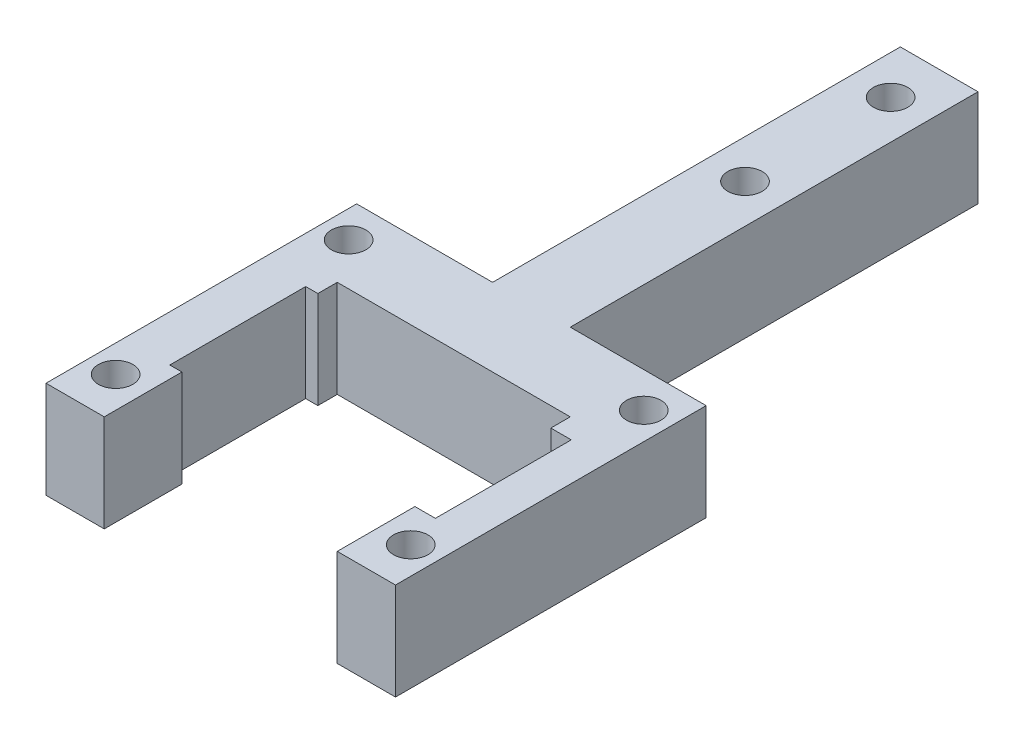
ISO-10303-21;
HEADER;
FILE_DESCRIPTION(('STEP AP214'),'2;1');
FILE_NAME('part.step','',(''),(''),'','','');
FILE_SCHEMA(('AUTOMOTIVE_DESIGN { 1 0 10303 214 1 1 1 1 }'));
ENDSEC;
DATA;
#1=APPLICATION_CONTEXT('core data for automotive mechanical design processes');
#2=APPLICATION_PROTOCOL_DEFINITION('international standard','automotive_design',2000,#1);
#3=PRODUCT_CONTEXT('',#1,'mechanical');
#4=PRODUCT('Part','Part','',(#3));
#5=PRODUCT_RELATED_PRODUCT_CATEGORY('part','',(#4));
#6=PRODUCT_DEFINITION_FORMATION('','',#4);
#7=PRODUCT_DEFINITION_CONTEXT('part definition',#1,'design');
#8=PRODUCT_DEFINITION('design','',#6,#7);
#9=PRODUCT_DEFINITION_SHAPE('','',#8);
#10=(LENGTH_UNIT() NAMED_UNIT(*) SI_UNIT(.MILLI.,.METRE.));
#11=(NAMED_UNIT(*) PLANE_ANGLE_UNIT() SI_UNIT($,.RADIAN.));
#12=(NAMED_UNIT(*) SI_UNIT($,.STERADIAN.) SOLID_ANGLE_UNIT());
#13=UNCERTAINTY_MEASURE_WITH_UNIT(LENGTH_MEASURE(1.E-05),#10,'distance_accuracy_value','');
#14=(GEOMETRIC_REPRESENTATION_CONTEXT(3) GLOBAL_UNCERTAINTY_ASSIGNED_CONTEXT((#13)) GLOBAL_UNIT_ASSIGNED_CONTEXT((#10,
#11,#12)) REPRESENTATION_CONTEXT('',''));
#15=CARTESIAN_POINT('',(0.,0.,0.));
#16=DIRECTION('',(0.,0.,1.));
#17=DIRECTION('',(1.,0.,0.));
#18=AXIS2_PLACEMENT_3D('',#15,#16,#17);
#19=CARTESIAN_POINT('',(12.,10.,9.22632055975592));
#20=DIRECTION('',(1.,0.,0.));
#21=DIRECTION('',(0.,0.,-1.));
#22=AXIS2_PLACEMENT_3D('',#19,#20,#21);
#23=PLANE('',#22);
#24=DIRECTION('',(0.,0.,1.));
#25=VECTOR('',#24,1.);
#26=CARTESIAN_POINT('',(12.,0.,9.22632055975592));
#27=LINE('',#26,#25);
#28=CARTESIAN_POINT('',(12.,0.,-14.7736794402441));
#29=VERTEX_POINT('',#28);
#30=CARTESIAN_POINT('',(12.,0.,-12.7736794402441));
#31=VERTEX_POINT('',#30);
#32=EDGE_CURVE('E194',#29,#31,#27,.T.);
#33=ORIENTED_EDGE('',*,*,#32,.T.);
#34=DIRECTION('',(0.,1.,0.));
#35=VECTOR('',#34,1.);
#36=CARTESIAN_POINT('',(12.,0.,-12.7736794402441));
#37=LINE('',#36,#35);
#38=CARTESIAN_POINT('',(12.,10.,-12.7736794402441));
#39=VERTEX_POINT('',#38);
#40=EDGE_CURVE('E284',#31,#39,#37,.T.);
#41=ORIENTED_EDGE('',*,*,#40,.T.);
#42=DIRECTION('',(0.,0.,1.));
#43=VECTOR('',#42,1.);
#44=CARTESIAN_POINT('',(12.,10.,9.22632055975592));
#45=LINE('',#44,#43);
#46=CARTESIAN_POINT('',(12.,10.,-14.7736794402441));
#47=VERTEX_POINT('',#46);
#48=EDGE_CURVE('E286',#47,#39,#45,.T.);
#49=ORIENTED_EDGE('',*,*,#48,.F.);
#50=DIRECTION('',(0.,-1.,0.));
#51=VECTOR('',#50,1.);
#52=CARTESIAN_POINT('',(12.,10.,-14.7736794402441));
#53=LINE('',#52,#51);
#54=EDGE_CURVE('E230',#47,#29,#53,.T.);
#55=ORIENTED_EDGE('',*,*,#54,.T.);
#56=EDGE_LOOP('',(#33,#41,#49,#55));
#57=FACE_BOUND('',#56,.T.);
#58=ADVANCED_FACE('F32',(#57),#23,.F.);
#59=CARTESIAN_POINT('',(-12.,10.,-14.7736794402441));
#60=DIRECTION('',(-1.,0.,0.));
#61=DIRECTION('',(0.,0.,1.));
#62=AXIS2_PLACEMENT_3D('',#59,#60,#61);
#63=PLANE('',#62);
#64=DIRECTION('',(0.,0.,-1.));
#65=VECTOR('',#64,1.);
#66=CARTESIAN_POINT('',(-12.,0.,-14.7736794402441));
#67=LINE('',#66,#65);
#68=CARTESIAN_POINT('',(-12.,0.,9.22632055975593));
#69=VERTEX_POINT('',#68);
#70=CARTESIAN_POINT('',(-12.,0.,1.22632055975593));
#71=VERTEX_POINT('',#70);
#72=EDGE_CURVE('E198',#69,#71,#67,.T.);
#73=ORIENTED_EDGE('',*,*,#72,.T.);
#74=DIRECTION('',(0.,1.,0.));
#75=VECTOR('',#74,1.);
#76=CARTESIAN_POINT('',(-12.,0.,1.22632055975593));
#77=LINE('',#76,#75);
#78=CARTESIAN_POINT('',(-12.,10.,1.22632055975593));
#79=VERTEX_POINT('',#78);
#80=EDGE_CURVE('E347',#71,#79,#77,.T.);
#81=ORIENTED_EDGE('',*,*,#80,.T.);
#82=DIRECTION('',(0.,0.,-1.));
#83=VECTOR('',#82,1.);
#84=CARTESIAN_POINT('',(-12.,10.,-14.7736794402441));
#85=LINE('',#84,#83);
#86=CARTESIAN_POINT('',(-12.,10.,9.22632055975593));
#87=VERTEX_POINT('',#86);
#88=EDGE_CURVE('E324',#87,#79,#85,.T.);
#89=ORIENTED_EDGE('',*,*,#88,.F.);
#90=DIRECTION('',(0.,-1.,0.));
#91=VECTOR('',#90,1.);
#92=CARTESIAN_POINT('',(-12.,10.,9.22632055975593));
#93=LINE('',#92,#91);
#94=EDGE_CURVE('E236',#87,#69,#93,.T.);
#95=ORIENTED_EDGE('',*,*,#94,.T.);
#96=EDGE_LOOP('',(#73,#81,#89,#95));
#97=FACE_BOUND('',#96,.T.);
#98=ADVANCED_FACE('F405',(#97),#63,.F.);
#99=CARTESIAN_POINT('',(-4.,10.,-22.7736794402441));
#100=DIRECTION('',(1.,0.,0.));
#101=DIRECTION('',(0.,0.,-1.));
#102=AXIS2_PLACEMENT_3D('',#99,#100,#101);
#103=PLANE('',#102);
#104=DIRECTION('',(0.,0.,1.));
#105=VECTOR('',#104,1.);
#106=CARTESIAN_POINT('',(-4.,0.,-22.7736794402441));
#107=LINE('',#106,#105);
#108=CARTESIAN_POINT('',(-4.00000000000002,0.,-64.7736794402441));
#109=VERTEX_POINT('',#108);
#110=CARTESIAN_POINT('',(-4.,0.,-22.7736794402441));
#111=VERTEX_POINT('',#110);
#112=EDGE_CURVE('E259',#109,#111,#107,.T.);
#113=ORIENTED_EDGE('',*,*,#112,.T.);
#114=DIRECTION('',(0.,-1.,0.));
#115=VECTOR('',#114,1.);
#116=CARTESIAN_POINT('',(-4.,10.,-22.7736794402441));
#117=LINE('',#116,#115);
#118=CARTESIAN_POINT('',(-4.,10.,-22.7736794402441));
#119=VERTEX_POINT('',#118);
#120=EDGE_CURVE('E11',#119,#111,#117,.T.);
#121=ORIENTED_EDGE('',*,*,#120,.F.);
#122=DIRECTION('',(0.,0.,1.));
#123=VECTOR('',#122,1.);
#124=CARTESIAN_POINT('',(-4.,10.,-22.7736794402441));
#125=LINE('',#124,#123);
#126=CARTESIAN_POINT('',(-4.00000000000002,10.,-64.7736794402441));
#127=VERTEX_POINT('',#126);
#128=EDGE_CURVE('E211',#127,#119,#125,.T.);
#129=ORIENTED_EDGE('',*,*,#128,.F.);
#130=DIRECTION('',(0.,-1.,0.));
#131=VECTOR('',#130,1.);
#132=CARTESIAN_POINT('',(-4.00000000000002,10.,-64.7736794402441));
#133=LINE('',#132,#131);
#134=EDGE_CURVE('E212',#127,#109,#133,.T.);
#135=ORIENTED_EDGE('',*,*,#134,.T.);
#136=EDGE_LOOP('',(#113,#121,#129,#135));
#137=FACE_BOUND('',#136,.T.);
#138=ADVANCED_FACE('F34',(#137),#103,.F.);
#139=CARTESIAN_POINT('',(-18.,10.,-22.7736794402441));
#140=DIRECTION('',(0.,0.,1.));
#141=DIRECTION('',(1.,0.,0.));
#142=AXIS2_PLACEMENT_3D('',#139,#140,#141);
#143=PLANE('',#142);
#144=DIRECTION('',(-1.,0.,0.));
#145=VECTOR('',#144,1.);
#146=CARTESIAN_POINT('',(-18.,0.,-22.7736794402441));
#147=LINE('',#146,#145);
#148=CARTESIAN_POINT('',(-18.,0.,-22.7736794402441));
#149=VERTEX_POINT('',#148);
#150=EDGE_CURVE('E253',#111,#149,#147,.T.);
#151=ORIENTED_EDGE('',*,*,#150,.T.);
#152=DIRECTION('',(0.,-1.,0.));
#153=VECTOR('',#152,1.);
#154=CARTESIAN_POINT('',(-18.,10.,-22.7736794402441));
#155=LINE('',#154,#153);
#156=CARTESIAN_POINT('',(-18.,10.,-22.7736794402441));
#157=VERTEX_POINT('',#156);
#158=EDGE_CURVE('E40',#157,#149,#155,.T.);
#159=ORIENTED_EDGE('',*,*,#158,.F.);
#160=DIRECTION('',(-1.,0.,0.));
#161=VECTOR('',#160,1.);
#162=CARTESIAN_POINT('',(-18.,10.,-22.7736794402441));
#163=LINE('',#162,#161);
#164=EDGE_CURVE('E319',#119,#157,#163,.T.);
#165=ORIENTED_EDGE('',*,*,#164,.F.);
#166=ORIENTED_EDGE('',*,*,#120,.T.);
#167=EDGE_LOOP('',(#151,#159,#165,#166));
#168=FACE_BOUND('',#167,.T.);
#169=ADVANCED_FACE('F430',(#168),#143,.F.);
#170=CARTESIAN_POINT('',(-18.,10.,9.22632055975593));
#171=DIRECTION('',(1.,0.,0.));
#172=DIRECTION('',(0.,0.,-1.));
#173=AXIS2_PLACEMENT_3D('',#170,#171,#172);
#174=PLANE('',#173);
#175=DIRECTION('',(0.,0.,1.));
#176=VECTOR('',#175,1.);
#177=CARTESIAN_POINT('',(-18.,0.,9.22632055975593));
#178=LINE('',#177,#176);
#179=CARTESIAN_POINT('',(-18.,0.,9.22632055975593));
#180=VERTEX_POINT('',#179);
#181=EDGE_CURVE('E248',#149,#180,#178,.T.);
#182=ORIENTED_EDGE('',*,*,#181,.T.);
#183=DIRECTION('',(0.,-1.,0.));
#184=VECTOR('',#183,1.);
#185=CARTESIAN_POINT('',(-18.,10.,9.22632055975593));
#186=LINE('',#185,#184);
#187=CARTESIAN_POINT('',(-18.,10.,9.22632055975593));
#188=VERTEX_POINT('',#187);
#189=EDGE_CURVE('E239',#188,#180,#186,.T.);
#190=ORIENTED_EDGE('',*,*,#189,.F.);
#191=DIRECTION('',(0.,0.,1.));
#192=VECTOR('',#191,1.);
#193=CARTESIAN_POINT('',(-18.,10.,9.22632055975593));
#194=LINE('',#193,#192);
#195=EDGE_CURVE('E249',#157,#188,#194,.T.);
#196=ORIENTED_EDGE('',*,*,#195,.F.);
#197=ORIENTED_EDGE('',*,*,#158,.T.);
#198=EDGE_LOOP('',(#182,#190,#196,#197));
#199=FACE_BOUND('',#198,.T.);
#200=ADVANCED_FACE('F246',(#199),#174,.F.);
#201=CARTESIAN_POINT('',(-12.,10.,9.22632055975593));
#202=DIRECTION('',(0.,0.,-1.));
#203=DIRECTION('',(-1.,0.,0.));
#204=AXIS2_PLACEMENT_3D('',#201,#202,#203);
#205=PLANE('',#204);
#206=DIRECTION('',(1.,0.,0.));
#207=VECTOR('',#206,1.);
#208=CARTESIAN_POINT('',(-12.,0.,9.22632055975593));
#209=LINE('',#208,#207);
#210=EDGE_CURVE('E255',#180,#69,#209,.T.);
#211=ORIENTED_EDGE('',*,*,#210,.T.);
#212=ORIENTED_EDGE('',*,*,#94,.F.);
#213=DIRECTION('',(1.,0.,0.));
#214=VECTOR('',#213,1.);
#215=CARTESIAN_POINT('',(-12.,10.,9.22632055975593));
#216=LINE('',#215,#214);
#217=EDGE_CURVE('E322',#188,#87,#216,.T.);
#218=ORIENTED_EDGE('',*,*,#217,.F.);
#219=ORIENTED_EDGE('',*,*,#189,.T.);
#220=EDGE_LOOP('',(#211,#212,#218,#219));
#221=FACE_BOUND('',#220,.T.);
#222=ADVANCED_FACE('F424',(#221),#205,.F.);
#223=CARTESIAN_POINT('',(-12.,10.,-12.7736794402441));
#224=VERTEX_POINT('',#223);
#225=CARTESIAN_POINT('',(-12.,10.,-14.7736794402441));
#226=VERTEX_POINT('',#225);
#227=EDGE_CURVE('E323',#224,#226,#85,.T.);
#228=ORIENTED_EDGE('',*,*,#227,.F.);
#229=DIRECTION('',(0.,1.,0.));
#230=VECTOR('',#229,1.);
#231=CARTESIAN_POINT('',(-12.,0.,-12.7736794402441));
#232=LINE('',#231,#230);
#233=CARTESIAN_POINT('',(-12.,0.,-12.7736794402441));
#234=VERTEX_POINT('',#233);
#235=EDGE_CURVE('E272',#234,#224,#232,.T.);
#236=ORIENTED_EDGE('',*,*,#235,.F.);
#237=CARTESIAN_POINT('',(-12.,0.,-14.7736794402441));
#238=VERTEX_POINT('',#237);
#239=EDGE_CURVE('E257',#234,#238,#67,.T.);
#240=ORIENTED_EDGE('',*,*,#239,.T.);
#241=DIRECTION('',(0.,-1.,0.));
#242=VECTOR('',#241,1.);
#243=CARTESIAN_POINT('',(-12.,10.,-14.7736794402441));
#244=LINE('',#243,#242);
#245=EDGE_CURVE('E233',#226,#238,#244,.T.);
#246=ORIENTED_EDGE('',*,*,#245,.F.);
#247=EDGE_LOOP('',(#228,#236,#240,#246));
#248=FACE_BOUND('',#247,.T.);
#249=ADVANCED_FACE('F270',(#248),#63,.F.);
#250=CARTESIAN_POINT('',(12.,10.,-14.7736794402441));
#251=DIRECTION('',(0.,0.,-1.));
#252=DIRECTION('',(-1.,0.,0.));
#253=AXIS2_PLACEMENT_3D('',#250,#251,#252);
#254=PLANE('',#253);
#255=DIRECTION('',(1.,0.,0.));
#256=VECTOR('',#255,1.);
#257=CARTESIAN_POINT('',(12.,0.,-14.7736794402441));
#258=LINE('',#257,#256);
#259=EDGE_CURVE('E195',#238,#29,#258,.T.);
#260=ORIENTED_EDGE('',*,*,#259,.T.);
#261=ORIENTED_EDGE('',*,*,#54,.F.);
#262=DIRECTION('',(1.,0.,0.));
#263=VECTOR('',#262,1.);
#264=CARTESIAN_POINT('',(12.,10.,-14.7736794402441));
#265=LINE('',#264,#263);
#266=EDGE_CURVE('E278',#226,#47,#265,.T.);
#267=ORIENTED_EDGE('',*,*,#266,.F.);
#268=ORIENTED_EDGE('',*,*,#245,.T.);
#269=EDGE_LOOP('',(#260,#261,#267,#268));
#270=FACE_BOUND('',#269,.T.);
#271=ADVANCED_FACE('F276',(#270),#254,.F.);
#272=CARTESIAN_POINT('',(12.,10.,1.22632055975593));
#273=VERTEX_POINT('',#272);
#274=CARTESIAN_POINT('',(12.,10.,9.22632055975592));
#275=VERTEX_POINT('',#274);
#276=EDGE_CURVE('E185',#273,#275,#45,.T.);
#277=ORIENTED_EDGE('',*,*,#276,.F.);
#278=DIRECTION('',(0.,1.,0.));
#279=VECTOR('',#278,1.);
#280=CARTESIAN_POINT('',(12.,0.,1.22632055975593));
#281=LINE('',#280,#279);
#282=CARTESIAN_POINT('',(12.,0.,1.22632055975593));
#283=VERTEX_POINT('',#282);
#284=EDGE_CURVE('E172',#283,#273,#281,.T.);
#285=ORIENTED_EDGE('',*,*,#284,.F.);
#286=CARTESIAN_POINT('',(12.,0.,9.22632055975592));
#287=VERTEX_POINT('',#286);
#288=EDGE_CURVE('E183',#283,#287,#27,.T.);
#289=ORIENTED_EDGE('',*,*,#288,.T.);
#290=DIRECTION('',(0.,-1.,0.));
#291=VECTOR('',#290,1.);
#292=CARTESIAN_POINT('',(12.,10.,9.22632055975592));
#293=LINE('',#292,#291);
#294=EDGE_CURVE('E228',#275,#287,#293,.T.);
#295=ORIENTED_EDGE('',*,*,#294,.F.);
#296=EDGE_LOOP('',(#277,#285,#289,#295));
#297=FACE_BOUND('',#296,.T.);
#298=ADVANCED_FACE('F181',(#297),#23,.F.);
#299=CARTESIAN_POINT('',(18.,10.,9.22632055975592));
#300=DIRECTION('',(0.,0.,-1.));
#301=DIRECTION('',(-1.,0.,0.));
#302=AXIS2_PLACEMENT_3D('',#299,#300,#301);
#303=PLANE('',#302);
#304=DIRECTION('',(1.,0.,0.));
#305=VECTOR('',#304,1.);
#306=CARTESIAN_POINT('',(18.,0.,9.22632055975592));
#307=LINE('',#306,#305);
#308=CARTESIAN_POINT('',(18.,0.,9.22632055975592));
#309=VERTEX_POINT('',#308);
#310=EDGE_CURVE('E193',#287,#309,#307,.T.);
#311=ORIENTED_EDGE('',*,*,#310,.T.);
#312=DIRECTION('',(0.,-1.,0.));
#313=VECTOR('',#312,1.);
#314=CARTESIAN_POINT('',(18.,10.,9.22632055975592));
#315=LINE('',#314,#313);
#316=CARTESIAN_POINT('',(18.,10.,9.22632055975592));
#317=VERTEX_POINT('',#316);
#318=EDGE_CURVE('E225',#317,#309,#315,.T.);
#319=ORIENTED_EDGE('',*,*,#318,.F.);
#320=DIRECTION('',(1.,0.,0.));
#321=VECTOR('',#320,1.);
#322=CARTESIAN_POINT('',(18.,10.,9.22632055975592));
#323=LINE('',#322,#321);
#324=EDGE_CURVE('E289',#275,#317,#323,.T.);
#325=ORIENTED_EDGE('',*,*,#324,.F.);
#326=ORIENTED_EDGE('',*,*,#294,.T.);
#327=EDGE_LOOP('',(#311,#319,#325,#326));
#328=FACE_BOUND('',#327,.T.);
#329=ADVANCED_FACE('F414',(#328),#303,.F.);
#330=CARTESIAN_POINT('',(18.,10.,-22.7736794402441));
#331=DIRECTION('',(-1.,0.,0.));
#332=DIRECTION('',(0.,0.,1.));
#333=AXIS2_PLACEMENT_3D('',#330,#331,#332);
#334=PLANE('',#333);
#335=DIRECTION('',(0.,0.,-1.));
#336=VECTOR('',#335,1.);
#337=CARTESIAN_POINT('',(18.,0.,-22.7736794402441));
#338=LINE('',#337,#336);
#339=CARTESIAN_POINT('',(18.,0.,-22.7736794402441));
#340=VERTEX_POINT('',#339);
#341=EDGE_CURVE('E203',#309,#340,#338,.T.);
#342=ORIENTED_EDGE('',*,*,#341,.T.);
#343=DIRECTION('',(0.,-1.,0.));
#344=VECTOR('',#343,1.);
#345=CARTESIAN_POINT('',(18.,10.,-22.7736794402441));
#346=LINE('',#345,#344);
#347=CARTESIAN_POINT('',(18.,10.,-22.7736794402441));
#348=VERTEX_POINT('',#347);
#349=EDGE_CURVE('E222',#348,#340,#346,.T.);
#350=ORIENTED_EDGE('',*,*,#349,.F.);
#351=DIRECTION('',(0.,0.,-1.));
#352=VECTOR('',#351,1.);
#353=CARTESIAN_POINT('',(18.,10.,-22.7736794402441));
#354=LINE('',#353,#352);
#355=EDGE_CURVE('E291',#317,#348,#354,.T.);
#356=ORIENTED_EDGE('',*,*,#355,.F.);
#357=ORIENTED_EDGE('',*,*,#318,.T.);
#358=EDGE_LOOP('',(#342,#350,#356,#357));
#359=FACE_BOUND('',#358,.T.);
#360=ADVANCED_FACE('F419',(#359),#334,.F.);
#361=CARTESIAN_POINT('',(4.,10.,-22.7736794402441));
#362=DIRECTION('',(0.,0.,1.));
#363=DIRECTION('',(1.,0.,0.));
#364=AXIS2_PLACEMENT_3D('',#361,#362,#363);
#365=PLANE('',#364);
#366=DIRECTION('',(-1.,0.,0.));
#367=VECTOR('',#366,1.);
#368=CARTESIAN_POINT('',(4.,0.,-22.7736794402441));
#369=LINE('',#368,#367);
#370=CARTESIAN_POINT('',(4.,0.,-22.7736794402441));
#371=VERTEX_POINT('',#370);
#372=EDGE_CURVE('E205',#340,#371,#369,.T.);
#373=ORIENTED_EDGE('',*,*,#372,.T.);
#374=DIRECTION('',(0.,-1.,0.));
#375=VECTOR('',#374,1.);
#376=CARTESIAN_POINT('',(4.,10.,-22.7736794402441));
#377=LINE('',#376,#375);
#378=CARTESIAN_POINT('',(4.,10.,-22.7736794402441));
#379=VERTEX_POINT('',#378);
#380=EDGE_CURVE('E219',#379,#371,#377,.T.);
#381=ORIENTED_EDGE('',*,*,#380,.F.);
#382=DIRECTION('',(-1.,0.,0.));
#383=VECTOR('',#382,1.);
#384=CARTESIAN_POINT('',(4.,10.,-22.7736794402441));
#385=LINE('',#384,#383);
#386=EDGE_CURVE('E297',#348,#379,#385,.T.);
#387=ORIENTED_EDGE('',*,*,#386,.F.);
#388=ORIENTED_EDGE('',*,*,#349,.T.);
#389=EDGE_LOOP('',(#373,#381,#387,#388));
#390=FACE_BOUND('',#389,.T.);
#391=ADVANCED_FACE('F449',(#390),#365,.F.);
#392=CARTESIAN_POINT('',(3.99999999999998,10.,-64.7736794402441));
#393=DIRECTION('',(-1.,0.,0.));
#394=DIRECTION('',(0.,0.,1.));
#395=AXIS2_PLACEMENT_3D('',#392,#393,#394);
#396=PLANE('',#395);
#397=DIRECTION('',(0.,0.,-1.));
#398=VECTOR('',#397,1.);
#399=CARTESIAN_POINT('',(3.99999999999998,0.,-64.7736794402441));
#400=LINE('',#399,#398);
#401=CARTESIAN_POINT('',(3.99999999999998,0.,-64.7736794402441));
#402=VERTEX_POINT('',#401);
#403=EDGE_CURVE('E207',#371,#402,#400,.T.);
#404=ORIENTED_EDGE('',*,*,#403,.T.);
#405=DIRECTION('',(0.,-1.,0.));
#406=VECTOR('',#405,1.);
#407=CARTESIAN_POINT('',(3.99999999999998,10.,-64.7736794402441));
#408=LINE('',#407,#406);
#409=CARTESIAN_POINT('',(3.99999999999998,10.,-64.7736794402441));
#410=VERTEX_POINT('',#409);
#411=EDGE_CURVE('E215',#410,#402,#408,.T.);
#412=ORIENTED_EDGE('',*,*,#411,.F.);
#413=DIRECTION('',(0.,0.,-1.));
#414=VECTOR('',#413,1.);
#415=CARTESIAN_POINT('',(3.99999999999998,10.,-64.7736794402441));
#416=LINE('',#415,#414);
#417=EDGE_CURVE('E299',#379,#410,#416,.T.);
#418=ORIENTED_EDGE('',*,*,#417,.F.);
#419=ORIENTED_EDGE('',*,*,#380,.T.);
#420=EDGE_LOOP('',(#404,#412,#418,#419));
#421=FACE_BOUND('',#420,.T.);
#422=ADVANCED_FACE('F445',(#421),#396,.F.);
#423=CARTESIAN_POINT('',(-4.00000000000002,10.,-64.7736794402441));
#424=DIRECTION('',(0.,0.,1.));
#425=DIRECTION('',(1.,0.,0.));
#426=AXIS2_PLACEMENT_3D('',#423,#424,#425);
#427=PLANE('',#426);
#428=DIRECTION('',(-1.,0.,0.));
#429=VECTOR('',#428,1.);
#430=CARTESIAN_POINT('',(-4.00000000000002,0.,-64.7736794402441));
#431=LINE('',#430,#429);
#432=EDGE_CURVE('E209',#402,#109,#431,.T.);
#433=ORIENTED_EDGE('',*,*,#432,.T.);
#434=ORIENTED_EDGE('',*,*,#134,.F.);
#435=DIRECTION('',(-1.,0.,0.));
#436=VECTOR('',#435,1.);
#437=CARTESIAN_POINT('',(-4.00000000000002,10.,-64.7736794402441));
#438=LINE('',#437,#436);
#439=EDGE_CURVE('E216',#410,#127,#438,.T.);
#440=ORIENTED_EDGE('',*,*,#439,.F.);
#441=ORIENTED_EDGE('',*,*,#411,.T.);
#442=EDGE_LOOP('',(#433,#434,#440,#441));
#443=FACE_BOUND('',#442,.T.);
#444=ADVANCED_FACE('F387',(#443),#427,.F.);
#445=CARTESIAN_POINT('',(0.,10.,0.));
#446=DIRECTION('',(0.,-1.,0.));
#447=DIRECTION('',(0.,0.,-1.));
#448=AXIS2_PLACEMENT_3D('',#445,#446,#447);
#449=PLANE('',#448);
#450=CARTESIAN_POINT('',(15.2,10.,-19.1445837320134));
#451=DIRECTION('',(0.,1.,0.));
#452=DIRECTION('',(0.,0.,1.));
#453=AXIS2_PLACEMENT_3D('',#450,#451,#452);
#454=CIRCLE('',#453,1.775);
#455=CARTESIAN_POINT('',(15.2,10.,-17.3695837320134));
#456=VERTEX_POINT('',#455);
#457=EDGE_CURVE('E349',#456,#456,#454,.T.);
#458=ORIENTED_EDGE('',*,*,#457,.F.);
#459=EDGE_LOOP('',(#458));
#460=FACE_BOUND('',#459,.T.);
#461=CARTESIAN_POINT('',(-15.2,10.,-19.1445837320134));
#462=DIRECTION('',(0.,1.,0.));
#463=DIRECTION('',(0.,0.,1.));
#464=AXIS2_PLACEMENT_3D('',#461,#462,#463);
#465=CIRCLE('',#464,1.775);
#466=CARTESIAN_POINT('',(-15.2,10.,-17.3695837320134));
#467=VERTEX_POINT('',#466);
#468=EDGE_CURVE('E358',#467,#467,#465,.T.);
#469=ORIENTED_EDGE('',*,*,#468,.F.);
#470=EDGE_LOOP('',(#469));
#471=FACE_BOUND('',#470,.T.);
#472=CARTESIAN_POINT('',(15.2,10.,4.85541626798664));
#473=DIRECTION('',(0.,1.,0.));
#474=DIRECTION('',(0.,0.,1.));
#475=AXIS2_PLACEMENT_3D('',#472,#473,#474);
#476=CIRCLE('',#475,1.775);
#477=CARTESIAN_POINT('',(15.2,10.,6.63041626798664));
#478=VERTEX_POINT('',#477);
#479=EDGE_CURVE('E364',#478,#478,#476,.T.);
#480=ORIENTED_EDGE('',*,*,#479,.F.);
#481=EDGE_LOOP('',(#480));
#482=FACE_BOUND('',#481,.T.);
#483=CARTESIAN_POINT('',(-15.2,10.,4.85541626798664));
#484=DIRECTION('',(0.,1.,0.));
#485=DIRECTION('',(0.,0.,1.));
#486=AXIS2_PLACEMENT_3D('',#483,#484,#485);
#487=CIRCLE('',#486,1.775);
#488=CARTESIAN_POINT('',(-15.2,10.,6.63041626798664));
#489=VERTEX_POINT('',#488);
#490=EDGE_CURVE('E370',#489,#489,#487,.T.);
#491=ORIENTED_EDGE('',*,*,#490,.F.);
#492=EDGE_LOOP('',(#491));
#493=FACE_BOUND('',#492,.T.);
#494=CARTESIAN_POINT('',(0.,10.,-59.7736794402441));
#495=DIRECTION('',(0.,1.,0.));
#496=DIRECTION('',(0.,0.,1.));
#497=AXIS2_PLACEMENT_3D('',#494,#495,#496);
#498=CIRCLE('',#497,1.775);
#499=CARTESIAN_POINT('',(0.,10.,-57.9986794402441));
#500=VERTEX_POINT('',#499);
#501=EDGE_CURVE('E314',#500,#500,#498,.T.);
#502=ORIENTED_EDGE('',*,*,#501,.F.);
#503=EDGE_LOOP('',(#502));
#504=FACE_BOUND('',#503,.T.);
#505=CARTESIAN_POINT('',(0.,10.,-44.7736794402441));
#506=DIRECTION('',(0.,1.,0.));
#507=DIRECTION('',(0.,0.,1.));
#508=AXIS2_PLACEMENT_3D('',#505,#506,#507);
#509=CIRCLE('',#508,1.775);
#510=CARTESIAN_POINT('',(0.,10.,-42.9986794402441));
#511=VERTEX_POINT('',#510);
#512=EDGE_CURVE('E306',#511,#511,#509,.T.);
#513=ORIENTED_EDGE('',*,*,#512,.F.);
#514=EDGE_LOOP('',(#513));
#515=FACE_BOUND('',#514,.T.);
#516=ORIENTED_EDGE('',*,*,#48,.T.);
#517=DIRECTION('',(-1.,0.,0.));
#518=VECTOR('',#517,1.);
#519=CARTESIAN_POINT('',(12.,10.,-12.7736794402441));
#520=LINE('',#519,#518);
#521=CARTESIAN_POINT('',(14.1063299515208,10.,-12.7736794402441));
#522=VERTEX_POINT('',#521);
#523=EDGE_CURVE('E177',#522,#39,#520,.T.);
#524=ORIENTED_EDGE('',*,*,#523,.F.);
#525=DIRECTION('',(0.,0.,-1.));
#526=VECTOR('',#525,1.);
#527=CARTESIAN_POINT('',(14.1063299515208,10.,1.22632055975593));
#528=LINE('',#527,#526);
#529=CARTESIAN_POINT('',(14.1063299515208,10.,1.22632055975593));
#530=VERTEX_POINT('',#529);
#531=EDGE_CURVE('E458',#530,#522,#528,.T.);
#532=ORIENTED_EDGE('',*,*,#531,.F.);
#533=DIRECTION('',(1.,0.,0.));
#534=VECTOR('',#533,1.);
#535=CARTESIAN_POINT('',(12.,10.,1.22632055975593));
#536=LINE('',#535,#534);
#537=EDGE_CURVE('E456',#273,#530,#536,.T.);
#538=ORIENTED_EDGE('',*,*,#537,.F.);
#539=ORIENTED_EDGE('',*,*,#276,.T.);
#540=ORIENTED_EDGE('',*,*,#324,.T.);
#541=ORIENTED_EDGE('',*,*,#355,.T.);
#542=ORIENTED_EDGE('',*,*,#386,.T.);
#543=ORIENTED_EDGE('',*,*,#417,.T.);
#544=ORIENTED_EDGE('',*,*,#439,.T.);
#545=ORIENTED_EDGE('',*,*,#128,.T.);
#546=ORIENTED_EDGE('',*,*,#164,.T.);
#547=ORIENTED_EDGE('',*,*,#195,.T.);
#548=ORIENTED_EDGE('',*,*,#217,.T.);
#549=ORIENTED_EDGE('',*,*,#88,.T.);
#550=DIRECTION('',(1.,0.,0.));
#551=VECTOR('',#550,1.);
#552=CARTESIAN_POINT('',(-12.,10.,1.22632055975593));
#553=LINE('',#552,#551);
#554=CARTESIAN_POINT('',(-13.25,10.,1.22632055975593));
#555=VERTEX_POINT('',#554);
#556=EDGE_CURVE('E337',#555,#79,#553,.T.);
#557=ORIENTED_EDGE('',*,*,#556,.F.);
#558=DIRECTION('',(0.,0.,1.));
#559=VECTOR('',#558,1.);
#560=CARTESIAN_POINT('',(-13.25,10.,1.22632055975593));
#561=LINE('',#560,#559);
#562=CARTESIAN_POINT('',(-13.25,10.,-12.7736794402441));
#563=VERTEX_POINT('',#562);
#564=EDGE_CURVE('E334',#563,#555,#561,.T.);
#565=ORIENTED_EDGE('',*,*,#564,.F.);
#566=DIRECTION('',(-1.,0.,0.));
#567=VECTOR('',#566,1.);
#568=CARTESIAN_POINT('',(-12.,10.,-12.7736794402441));
#569=LINE('',#568,#567);
#570=EDGE_CURVE('E332',#224,#563,#569,.T.);
#571=ORIENTED_EDGE('',*,*,#570,.F.);
#572=ORIENTED_EDGE('',*,*,#227,.T.);
#573=ORIENTED_EDGE('',*,*,#266,.T.);
#574=EDGE_LOOP('',(#516,#524,#532,#538,#539,#540,#541,#542,#543,#544,#545,#546,#547,#548,#549,
#557,#565,#571,#572,#573));
#575=FACE_BOUND('',#574,.T.);
#576=ADVANCED_FACE('F329',(#460,#471,#482,#493,#504,#515,#575),#449,.F.);
#577=CARTESIAN_POINT('',(0.,0.,0.));
#578=DIRECTION('',(0.,-1.,0.));
#579=DIRECTION('',(0.,0.,-1.));
#580=AXIS2_PLACEMENT_3D('',#577,#578,#579);
#581=PLANE('',#580);
#582=DIRECTION('',(-1.,0.,0.));
#583=VECTOR('',#582,1.);
#584=CARTESIAN_POINT('',(12.,0.,-12.7736794402441));
#585=LINE('',#584,#583);
#586=CARTESIAN_POINT('',(14.1063299515208,0.,-12.7736794402441));
#587=VERTEX_POINT('',#586);
#588=EDGE_CURVE('E186',#587,#31,#585,.T.);
#589=ORIENTED_EDGE('',*,*,#588,.T.);
#590=ORIENTED_EDGE('',*,*,#32,.F.);
#591=ORIENTED_EDGE('',*,*,#259,.F.);
#592=ORIENTED_EDGE('',*,*,#239,.F.);
#593=DIRECTION('',(-1.,0.,0.));
#594=VECTOR('',#593,1.);
#595=CARTESIAN_POINT('',(-12.,0.,-12.7736794402441));
#596=LINE('',#595,#594);
#597=CARTESIAN_POINT('',(-13.25,0.,-12.7736794402441));
#598=VERTEX_POINT('',#597);
#599=EDGE_CURVE('E346',#234,#598,#596,.T.);
#600=ORIENTED_EDGE('',*,*,#599,.T.);
#601=DIRECTION('',(0.,0.,1.));
#602=VECTOR('',#601,1.);
#603=CARTESIAN_POINT('',(-13.25,0.,1.22632055975593));
#604=LINE('',#603,#602);
#605=CARTESIAN_POINT('',(-13.25,0.,1.22632055975593));
#606=VERTEX_POINT('',#605);
#607=EDGE_CURVE('E55',#598,#606,#604,.T.);
#608=ORIENTED_EDGE('',*,*,#607,.T.);
#609=DIRECTION('',(1.,0.,0.));
#610=VECTOR('',#609,1.);
#611=CARTESIAN_POINT('',(-12.,0.,1.22632055975593));
#612=LINE('',#611,#610);
#613=EDGE_CURVE('E342',#606,#71,#612,.T.);
#614=ORIENTED_EDGE('',*,*,#613,.T.);
#615=ORIENTED_EDGE('',*,*,#72,.F.);
#616=ORIENTED_EDGE('',*,*,#210,.F.);
#617=ORIENTED_EDGE('',*,*,#181,.F.);
#618=ORIENTED_EDGE('',*,*,#150,.F.);
#619=ORIENTED_EDGE('',*,*,#112,.F.);
#620=ORIENTED_EDGE('',*,*,#432,.F.);
#621=ORIENTED_EDGE('',*,*,#403,.F.);
#622=ORIENTED_EDGE('',*,*,#372,.F.);
#623=ORIENTED_EDGE('',*,*,#341,.F.);
#624=ORIENTED_EDGE('',*,*,#310,.F.);
#625=ORIENTED_EDGE('',*,*,#288,.F.);
#626=DIRECTION('',(1.,0.,0.));
#627=VECTOR('',#626,1.);
#628=CARTESIAN_POINT('',(12.,0.,1.22632055975593));
#629=LINE('',#628,#627);
#630=CARTESIAN_POINT('',(14.1063299515208,0.,1.22632055975593));
#631=VERTEX_POINT('',#630);
#632=EDGE_CURVE('E168',#283,#631,#629,.T.);
#633=ORIENTED_EDGE('',*,*,#632,.T.);
#634=DIRECTION('',(0.,0.,-1.));
#635=VECTOR('',#634,1.);
#636=CARTESIAN_POINT('',(14.1063299515208,0.,1.22632055975593));
#637=LINE('',#636,#635);
#638=EDGE_CURVE('E47',#631,#587,#637,.T.);
#639=ORIENTED_EDGE('',*,*,#638,.T.);
#640=EDGE_LOOP('',(#589,#590,#591,#592,#600,#608,#614,#615,#616,#617,#618,#619,#620,#621,#622,
#623,#624,#625,#633,#639));
#641=FACE_BOUND('',#640,.T.);
#642=CARTESIAN_POINT('',(15.2,0.,-19.1445837320134));
#643=DIRECTION('',(0.,1.,0.));
#644=DIRECTION('',(0.,0.,1.));
#645=AXIS2_PLACEMENT_3D('',#642,#643,#644);
#646=CIRCLE('',#645,1.775);
#647=CARTESIAN_POINT('',(15.2,0.,-17.3695837320134));
#648=VERTEX_POINT('',#647);
#649=EDGE_CURVE('E355',#648,#648,#646,.T.);
#650=ORIENTED_EDGE('',*,*,#649,.T.);
#651=EDGE_LOOP('',(#650));
#652=FACE_BOUND('',#651,.T.);
#653=CARTESIAN_POINT('',(-15.2,0.,-19.1445837320134));
#654=DIRECTION('',(0.,1.,0.));
#655=DIRECTION('',(0.,0.,1.));
#656=AXIS2_PLACEMENT_3D('',#653,#654,#655);
#657=CIRCLE('',#656,1.775);
#658=CARTESIAN_POINT('',(-15.2,0.,-17.3695837320134));
#659=VERTEX_POINT('',#658);
#660=EDGE_CURVE('E361',#659,#659,#657,.T.);
#661=ORIENTED_EDGE('',*,*,#660,.T.);
#662=EDGE_LOOP('',(#661));
#663=FACE_BOUND('',#662,.T.);
#664=CARTESIAN_POINT('',(15.2,0.,4.85541626798664));
#665=DIRECTION('',(0.,1.,0.));
#666=DIRECTION('',(0.,0.,1.));
#667=AXIS2_PLACEMENT_3D('',#664,#665,#666);
#668=CIRCLE('',#667,1.775);
#669=CARTESIAN_POINT('',(15.2,0.,6.63041626798664));
#670=VERTEX_POINT('',#669);
#671=EDGE_CURVE('E367',#670,#670,#668,.T.);
#672=ORIENTED_EDGE('',*,*,#671,.T.);
#673=EDGE_LOOP('',(#672));
#674=FACE_BOUND('',#673,.T.);
#675=CARTESIAN_POINT('',(-15.2,0.,4.85541626798664));
#676=DIRECTION('',(0.,1.,0.));
#677=DIRECTION('',(0.,0.,1.));
#678=AXIS2_PLACEMENT_3D('',#675,#676,#677);
#679=CIRCLE('',#678,1.775);
#680=CARTESIAN_POINT('',(-15.2,0.,6.63041626798664));
#681=VERTEX_POINT('',#680);
#682=EDGE_CURVE('E373',#681,#681,#679,.T.);
#683=ORIENTED_EDGE('',*,*,#682,.T.);
#684=EDGE_LOOP('',(#683));
#685=FACE_BOUND('',#684,.T.);
#686=CARTESIAN_POINT('',(0.,0.,-59.7736794402441));
#687=DIRECTION('',(0.,1.,0.));
#688=DIRECTION('',(0.,0.,1.));
#689=AXIS2_PLACEMENT_3D('',#686,#687,#688);
#690=CIRCLE('',#689,1.775);
#691=CARTESIAN_POINT('',(0.,0.,-57.9986794402441));
#692=VERTEX_POINT('',#691);
#693=EDGE_CURVE('E311',#692,#692,#690,.T.);
#694=ORIENTED_EDGE('',*,*,#693,.T.);
#695=EDGE_LOOP('',(#694));
#696=FACE_BOUND('',#695,.T.);
#697=CARTESIAN_POINT('',(0.,0.,-44.7736794402441));
#698=DIRECTION('',(0.,1.,0.));
#699=DIRECTION('',(0.,0.,1.));
#700=AXIS2_PLACEMENT_3D('',#697,#698,#699);
#701=CIRCLE('',#700,1.775);
#702=CARTESIAN_POINT('',(0.,0.,-42.9986794402441));
#703=VERTEX_POINT('',#702);
#704=EDGE_CURVE('E302',#703,#703,#701,.T.);
#705=ORIENTED_EDGE('',*,*,#704,.T.);
#706=EDGE_LOOP('',(#705));
#707=FACE_BOUND('',#706,.T.);
#708=ADVANCED_FACE('F190',(#641,#652,#663,#674,#685,#696,#707),#581,.T.);
#709=CARTESIAN_POINT('',(0.,0.,-44.7736794402441));
#710=DIRECTION('',(0.,1.,0.));
#711=DIRECTION('',(0.,0.,1.));
#712=AXIS2_PLACEMENT_3D('',#709,#710,#711);
#713=CYLINDRICAL_SURFACE('',#712,1.775);
#714=ORIENTED_EDGE('',*,*,#704,.F.);
#715=EDGE_LOOP('',(#714));
#716=FACE_BOUND('',#715,.T.);
#717=ORIENTED_EDGE('',*,*,#512,.T.);
#718=EDGE_LOOP('',(#717));
#719=FACE_BOUND('',#718,.T.);
#720=ADVANCED_FACE('F392',(#716,#719),#713,.F.);
#721=CARTESIAN_POINT('',(0.,0.,-59.7736794402441));
#722=DIRECTION('',(0.,1.,0.));
#723=DIRECTION('',(0.,0.,1.));
#724=AXIS2_PLACEMENT_3D('',#721,#722,#723);
#725=CYLINDRICAL_SURFACE('',#724,1.775);
#726=ORIENTED_EDGE('',*,*,#693,.F.);
#727=EDGE_LOOP('',(#726));
#728=FACE_BOUND('',#727,.T.);
#729=ORIENTED_EDGE('',*,*,#501,.T.);
#730=EDGE_LOOP('',(#729));
#731=FACE_BOUND('',#730,.T.);
#732=ADVANCED_FACE('F383',(#728,#731),#725,.F.);
#733=CARTESIAN_POINT('',(-15.2,0.,4.85541626798664));
#734=DIRECTION('',(0.,1.,0.));
#735=DIRECTION('',(0.,0.,1.));
#736=AXIS2_PLACEMENT_3D('',#733,#734,#735);
#737=CYLINDRICAL_SURFACE('',#736,1.775);
#738=ORIENTED_EDGE('',*,*,#682,.F.);
#739=EDGE_LOOP('',(#738));
#740=FACE_BOUND('',#739,.T.);
#741=ORIENTED_EDGE('',*,*,#490,.T.);
#742=EDGE_LOOP('',(#741));
#743=FACE_BOUND('',#742,.T.);
#744=ADVANCED_FACE('F400',(#740,#743),#737,.F.);
#745=CARTESIAN_POINT('',(15.2,0.,4.85541626798664));
#746=DIRECTION('',(0.,1.,0.));
#747=DIRECTION('',(0.,0.,1.));
#748=AXIS2_PLACEMENT_3D('',#745,#746,#747);
#749=CYLINDRICAL_SURFACE('',#748,1.775);
#750=ORIENTED_EDGE('',*,*,#671,.F.);
#751=EDGE_LOOP('',(#750));
#752=FACE_BOUND('',#751,.T.);
#753=ORIENTED_EDGE('',*,*,#479,.T.);
#754=EDGE_LOOP('',(#753));
#755=FACE_BOUND('',#754,.T.);
#756=ADVANCED_FACE('F495',(#752,#755),#749,.F.);
#757=CARTESIAN_POINT('',(-15.2,0.,-19.1445837320134));
#758=DIRECTION('',(0.,1.,0.));
#759=DIRECTION('',(0.,0.,1.));
#760=AXIS2_PLACEMENT_3D('',#757,#758,#759);
#761=CYLINDRICAL_SURFACE('',#760,1.775);
#762=ORIENTED_EDGE('',*,*,#660,.F.);
#763=EDGE_LOOP('',(#762));
#764=FACE_BOUND('',#763,.T.);
#765=ORIENTED_EDGE('',*,*,#468,.T.);
#766=EDGE_LOOP('',(#765));
#767=FACE_BOUND('',#766,.T.);
#768=ADVANCED_FACE('F491',(#764,#767),#761,.F.);
#769=CARTESIAN_POINT('',(15.2,0.,-19.1445837320134));
#770=DIRECTION('',(0.,1.,0.));
#771=DIRECTION('',(0.,0.,1.));
#772=AXIS2_PLACEMENT_3D('',#769,#770,#771);
#773=CYLINDRICAL_SURFACE('',#772,1.775);
#774=ORIENTED_EDGE('',*,*,#649,.F.);
#775=EDGE_LOOP('',(#774));
#776=FACE_BOUND('',#775,.T.);
#777=ORIENTED_EDGE('',*,*,#457,.T.);
#778=EDGE_LOOP('',(#777));
#779=FACE_BOUND('',#778,.T.);
#780=ADVANCED_FACE('F488',(#776,#779),#773,.F.);
#781=CARTESIAN_POINT('',(-12.,0.,1.22632055975593));
#782=DIRECTION('',(0.,0.,1.));
#783=DIRECTION('',(1.,0.,0.));
#784=AXIS2_PLACEMENT_3D('',#781,#782,#783);
#785=PLANE('',#784);
#786=ORIENTED_EDGE('',*,*,#556,.T.);
#787=ORIENTED_EDGE('',*,*,#80,.F.);
#788=ORIENTED_EDGE('',*,*,#613,.F.);
#789=DIRECTION('',(0.,1.,0.));
#790=VECTOR('',#789,1.);
#791=CARTESIAN_POINT('',(-13.25,0.,1.22632055975593));
#792=LINE('',#791,#790);
#793=EDGE_CURVE('E350',#606,#555,#792,.T.);
#794=ORIENTED_EDGE('',*,*,#793,.T.);
#795=EDGE_LOOP('',(#786,#787,#788,#794));
#796=FACE_BOUND('',#795,.T.);
#797=ADVANCED_FACE('F470',(#796),#785,.F.);
#798=CARTESIAN_POINT('',(-13.25,0.,1.22632055975593));
#799=DIRECTION('',(-1.,0.,0.));
#800=DIRECTION('',(0.,0.,1.));
#801=AXIS2_PLACEMENT_3D('',#798,#799,#800);
#802=PLANE('',#801);
#803=ORIENTED_EDGE('',*,*,#564,.T.);
#804=ORIENTED_EDGE('',*,*,#793,.F.);
#805=ORIENTED_EDGE('',*,*,#607,.F.);
#806=DIRECTION('',(0.,1.,0.));
#807=VECTOR('',#806,1.);
#808=CARTESIAN_POINT('',(-13.25,0.,-12.7736794402441));
#809=LINE('',#808,#807);
#810=EDGE_CURVE('E352',#598,#563,#809,.T.);
#811=ORIENTED_EDGE('',*,*,#810,.T.);
#812=EDGE_LOOP('',(#803,#804,#805,#811));
#813=FACE_BOUND('',#812,.T.);
#814=ADVANCED_FACE('F473',(#813),#802,.F.);
#815=CARTESIAN_POINT('',(-12.,0.,-12.7736794402441));
#816=DIRECTION('',(0.,0.,-1.));
#817=DIRECTION('',(-1.,0.,0.));
#818=AXIS2_PLACEMENT_3D('',#815,#816,#817);
#819=PLANE('',#818);
#820=ORIENTED_EDGE('',*,*,#570,.T.);
#821=ORIENTED_EDGE('',*,*,#810,.F.);
#822=ORIENTED_EDGE('',*,*,#599,.F.);
#823=ORIENTED_EDGE('',*,*,#235,.T.);
#824=EDGE_LOOP('',(#820,#821,#822,#823));
#825=FACE_BOUND('',#824,.T.);
#826=ADVANCED_FACE('F474',(#825),#819,.F.);
#827=CARTESIAN_POINT('',(12.,0.,-12.7736794402441));
#828=DIRECTION('',(0.,0.,-1.));
#829=DIRECTION('',(-1.,0.,0.));
#830=AXIS2_PLACEMENT_3D('',#827,#828,#829);
#831=PLANE('',#830);
#832=ORIENTED_EDGE('',*,*,#523,.T.);
#833=ORIENTED_EDGE('',*,*,#40,.F.);
#834=ORIENTED_EDGE('',*,*,#588,.F.);
#835=DIRECTION('',(0.,1.,0.));
#836=VECTOR('',#835,1.);
#837=CARTESIAN_POINT('',(14.1063299515208,0.,-12.7736794402441));
#838=LINE('',#837,#836);
#839=EDGE_CURVE('E339',#587,#522,#838,.T.);
#840=ORIENTED_EDGE('',*,*,#839,.T.);
#841=EDGE_LOOP('',(#832,#833,#834,#840));
#842=FACE_BOUND('',#841,.T.);
#843=ADVANCED_FACE('F476',(#842),#831,.F.);
#844=CARTESIAN_POINT('',(14.1063299515208,0.,1.22632055975593));
#845=DIRECTION('',(1.,0.,0.));
#846=DIRECTION('',(0.,0.,-1.));
#847=AXIS2_PLACEMENT_3D('',#844,#845,#846);
#848=PLANE('',#847);
#849=ORIENTED_EDGE('',*,*,#531,.T.);
#850=ORIENTED_EDGE('',*,*,#839,.F.);
#851=ORIENTED_EDGE('',*,*,#638,.F.);
#852=DIRECTION('',(0.,1.,0.));
#853=VECTOR('',#852,1.);
#854=CARTESIAN_POINT('',(14.1063299515208,0.,1.22632055975593));
#855=LINE('',#854,#853);
#856=EDGE_CURVE('E174',#631,#530,#855,.T.);
#857=ORIENTED_EDGE('',*,*,#856,.T.);
#858=EDGE_LOOP('',(#849,#850,#851,#857));
#859=FACE_BOUND('',#858,.T.);
#860=ADVANCED_FACE('F482',(#859),#848,.F.);
#861=CARTESIAN_POINT('',(12.,0.,1.22632055975593));
#862=DIRECTION('',(0.,0.,1.));
#863=DIRECTION('',(1.,0.,0.));
#864=AXIS2_PLACEMENT_3D('',#861,#862,#863);
#865=PLANE('',#864);
#866=ORIENTED_EDGE('',*,*,#537,.T.);
#867=ORIENTED_EDGE('',*,*,#856,.F.);
#868=ORIENTED_EDGE('',*,*,#632,.F.);
#869=ORIENTED_EDGE('',*,*,#284,.T.);
#870=EDGE_LOOP('',(#866,#867,#868,#869));
#871=FACE_BOUND('',#870,.T.);
#872=ADVANCED_FACE('F171',(#871),#865,.F.);
#873=CLOSED_SHELL('',(#58,#98,#138,#169,#200,#222,#249,#271,#298,#329,#360,#391,#422,#444,#576,
#708,#720,#732,#744,#756,#768,#780,#797,#814,#826,#843,#860,#872));
#874=MANIFOLD_SOLID_BREP('B2',#873);
#875=ADVANCED_BREP_SHAPE_REPRESENTATION('',(#18,#874),#14);
#876=SHAPE_DEFINITION_REPRESENTATION(#9,#875);
ENDSEC;
END-ISO-10303-21;
